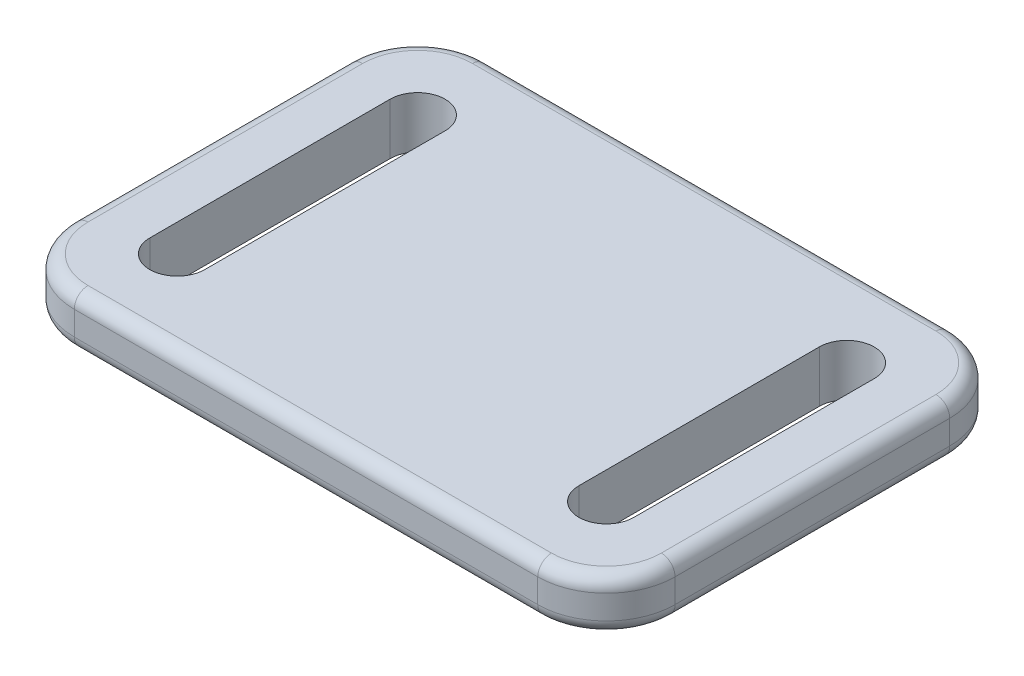
ISO-10303-21;
HEADER;
FILE_DESCRIPTION(('STEP AP214'),'2;1');
FILE_NAME('part.step','',(''),(''),'','','');
FILE_SCHEMA(('AUTOMOTIVE_DESIGN { 1 0 10303 214 1 1 1 1 }'));
ENDSEC;
DATA;
#1=APPLICATION_CONTEXT('core data for automotive mechanical design processes');
#2=APPLICATION_PROTOCOL_DEFINITION('international standard','automotive_design',2000,#1);
#3=PRODUCT_CONTEXT('',#1,'mechanical');
#4=PRODUCT('Part','Part','',(#3));
#5=PRODUCT_RELATED_PRODUCT_CATEGORY('part','',(#4));
#6=PRODUCT_DEFINITION_FORMATION('','',#4);
#7=PRODUCT_DEFINITION_CONTEXT('part definition',#1,'design');
#8=PRODUCT_DEFINITION('design','',#6,#7);
#9=PRODUCT_DEFINITION_SHAPE('','',#8);
#10=(LENGTH_UNIT() NAMED_UNIT(*) SI_UNIT(.MILLI.,.METRE.));
#11=(NAMED_UNIT(*) PLANE_ANGLE_UNIT() SI_UNIT($,.RADIAN.));
#12=(NAMED_UNIT(*) SI_UNIT($,.STERADIAN.) SOLID_ANGLE_UNIT());
#13=UNCERTAINTY_MEASURE_WITH_UNIT(LENGTH_MEASURE(1.E-05),#10,'distance_accuracy_value','');
#14=(GEOMETRIC_REPRESENTATION_CONTEXT(3) GLOBAL_UNCERTAINTY_ASSIGNED_CONTEXT((#13)) GLOBAL_UNIT_ASSIGNED_CONTEXT((#10,
#11,#12)) REPRESENTATION_CONTEXT('',''));
#15=CARTESIAN_POINT('',(0.,0.,0.));
#16=DIRECTION('',(0.,0.,1.));
#17=DIRECTION('',(1.,0.,0.));
#18=AXIS2_PLACEMENT_3D('',#15,#16,#17);
#19=CARTESIAN_POINT('',(0.,3.,0.));
#20=DIRECTION('',(0.,0.,-1.));
#21=DIRECTION('',(-1.,0.,0.));
#22=AXIS2_PLACEMENT_3D('',#19,#20,#21);
#23=PLANE('',#22);
#24=DIRECTION('',(0.,-1.,0.));
#25=VECTOR('',#24,1.);
#26=CARTESIAN_POINT('',(31.,3.,0.));
#27=LINE('',#26,#25);
#28=CARTESIAN_POINT('',(31.,0.8,0.));
#29=VERTEX_POINT('',#28);
#30=CARTESIAN_POINT('',(31.,2.2,0.));
#31=VERTEX_POINT('',#30);
#32=EDGE_CURVE('E294',#29,#31,#27,.F.);
#33=ORIENTED_EDGE('',*,*,#32,.T.);
#34=DIRECTION('',(1.,0.,0.));
#35=VECTOR('',#34,1.);
#36=CARTESIAN_POINT('',(4.,2.2,0.));
#37=LINE('',#36,#35);
#38=CARTESIAN_POINT('',(4.,2.2,0.));
#39=VERTEX_POINT('',#38);
#40=EDGE_CURVE('E330',#31,#39,#37,.F.);
#41=ORIENTED_EDGE('',*,*,#40,.T.);
#42=DIRECTION('',(0.,-1.,0.));
#43=VECTOR('',#42,1.);
#44=CARTESIAN_POINT('',(4.,0.,0.));
#45=LINE('',#44,#43);
#46=CARTESIAN_POINT('',(4.,0.8,0.));
#47=VERTEX_POINT('',#46);
#48=EDGE_CURVE('E297',#39,#47,#45,.T.);
#49=ORIENTED_EDGE('',*,*,#48,.T.);
#50=DIRECTION('',(1.,0.,0.));
#51=VECTOR('',#50,1.);
#52=CARTESIAN_POINT('',(0.,0.8,0.));
#53=LINE('',#52,#51);
#54=EDGE_CURVE('E328',#47,#29,#53,.T.);
#55=ORIENTED_EDGE('',*,*,#54,.T.);
#56=EDGE_LOOP('',(#33,#41,#49,#55));
#57=FACE_BOUND('',#56,.T.);
#58=ADVANCED_FACE('F41',(#57),#23,.F.);
#59=CARTESIAN_POINT('',(35.,3.,0.));
#60=DIRECTION('',(-1.,0.,0.));
#61=DIRECTION('',(0.,0.,1.));
#62=AXIS2_PLACEMENT_3D('',#59,#60,#61);
#63=PLANE('',#62);
#64=DIRECTION('',(0.,-1.,0.));
#65=VECTOR('',#64,1.);
#66=CARTESIAN_POINT('',(35.,3.,-4.));
#67=LINE('',#66,#65);
#68=CARTESIAN_POINT('',(35.,2.2,-4.));
#69=VERTEX_POINT('',#68);
#70=CARTESIAN_POINT('',(35.,0.8,-4.));
#71=VERTEX_POINT('',#70);
#72=EDGE_CURVE('E303',#69,#71,#67,.T.);
#73=ORIENTED_EDGE('',*,*,#72,.T.);
#74=DIRECTION('',(0.,0.,-1.));
#75=VECTOR('',#74,1.);
#76=CARTESIAN_POINT('',(35.,0.8,0.));
#77=LINE('',#76,#75);
#78=CARTESIAN_POINT('',(35.,0.8,-20.));
#79=VERTEX_POINT('',#78);
#80=EDGE_CURVE('E11',#71,#79,#77,.T.);
#81=ORIENTED_EDGE('',*,*,#80,.T.);
#82=DIRECTION('',(0.,-1.,0.));
#83=VECTOR('',#82,1.);
#84=CARTESIAN_POINT('',(35.,3.,-20.));
#85=LINE('',#84,#83);
#86=CARTESIAN_POINT('',(35.,2.2,-20.));
#87=VERTEX_POINT('',#86);
#88=EDGE_CURVE('E300',#79,#87,#85,.F.);
#89=ORIENTED_EDGE('',*,*,#88,.T.);
#90=DIRECTION('',(0.,0.,-1.));
#91=VECTOR('',#90,1.);
#92=CARTESIAN_POINT('',(35.,2.2,-4.));
#93=LINE('',#92,#91);
#94=EDGE_CURVE('E50',#87,#69,#93,.F.);
#95=ORIENTED_EDGE('',*,*,#94,.T.);
#96=EDGE_LOOP('',(#73,#81,#89,#95));
#97=FACE_BOUND('',#96,.T.);
#98=ADVANCED_FACE('F440',(#97),#63,.F.);
#99=CARTESIAN_POINT('',(0.,3.,-24.));
#100=DIRECTION('',(0.,0.,-1.));
#101=DIRECTION('',(-1.,0.,0.));
#102=AXIS2_PLACEMENT_3D('',#99,#100,#101);
#103=PLANE('',#102);
#104=DIRECTION('',(0.,-1.,0.));
#105=VECTOR('',#104,1.);
#106=CARTESIAN_POINT('',(4.,3.,-24.));
#107=LINE('',#106,#105);
#108=CARTESIAN_POINT('',(4.,0.8,-24.));
#109=VERTEX_POINT('',#108);
#110=CARTESIAN_POINT('',(4.,2.2,-24.));
#111=VERTEX_POINT('',#110);
#112=EDGE_CURVE('E291',#109,#111,#107,.F.);
#113=ORIENTED_EDGE('',*,*,#112,.T.);
#114=DIRECTION('',(1.,0.,0.));
#115=VECTOR('',#114,1.);
#116=CARTESIAN_POINT('',(0.,2.2,-24.));
#117=LINE('',#116,#115);
#118=CARTESIAN_POINT('',(31.,2.2,-24.));
#119=VERTEX_POINT('',#118);
#120=EDGE_CURVE('E347',#111,#119,#117,.T.);
#121=ORIENTED_EDGE('',*,*,#120,.T.);
#122=DIRECTION('',(0.,-1.,0.));
#123=VECTOR('',#122,1.);
#124=CARTESIAN_POINT('',(31.,0.,-24.));
#125=LINE('',#124,#123);
#126=CARTESIAN_POINT('',(31.,0.8,-24.));
#127=VERTEX_POINT('',#126);
#128=EDGE_CURVE('E288',#119,#127,#125,.T.);
#129=ORIENTED_EDGE('',*,*,#128,.T.);
#130=DIRECTION('',(1.,0.,0.));
#131=VECTOR('',#130,1.);
#132=CARTESIAN_POINT('',(4.,0.8,-24.));
#133=LINE('',#132,#131);
#134=EDGE_CURVE('E345',#127,#109,#133,.F.);
#135=ORIENTED_EDGE('',*,*,#134,.T.);
#136=EDGE_LOOP('',(#113,#121,#129,#135));
#137=FACE_BOUND('',#136,.T.);
#138=ADVANCED_FACE('F426',(#137),#103,.T.);
#139=CARTESIAN_POINT('',(0.,3.,0.));
#140=DIRECTION('',(-1.,0.,0.));
#141=DIRECTION('',(0.,0.,1.));
#142=AXIS2_PLACEMENT_3D('',#139,#140,#141);
#143=PLANE('',#142);
#144=DIRECTION('',(0.,-1.,0.));
#145=VECTOR('',#144,1.);
#146=CARTESIAN_POINT('',(0.,3.,-4.));
#147=LINE('',#146,#145);
#148=CARTESIAN_POINT('',(0.,0.8,-4.));
#149=VERTEX_POINT('',#148);
#150=CARTESIAN_POINT('',(0.,2.2,-4.));
#151=VERTEX_POINT('',#150);
#152=EDGE_CURVE('E282',#149,#151,#147,.F.);
#153=ORIENTED_EDGE('',*,*,#152,.T.);
#154=DIRECTION('',(0.,0.,-1.));
#155=VECTOR('',#154,1.);
#156=CARTESIAN_POINT('',(0.,2.2,0.));
#157=LINE('',#156,#155);
#158=CARTESIAN_POINT('',(0.,2.2,-20.));
#159=VERTEX_POINT('',#158);
#160=EDGE_CURVE('E339',#151,#159,#157,.T.);
#161=ORIENTED_EDGE('',*,*,#160,.T.);
#162=DIRECTION('',(0.,-1.,0.));
#163=VECTOR('',#162,1.);
#164=CARTESIAN_POINT('',(0.,3.,-20.));
#165=LINE('',#164,#163);
#166=CARTESIAN_POINT('',(0.,0.8,-20.));
#167=VERTEX_POINT('',#166);
#168=EDGE_CURVE('E285',#159,#167,#165,.T.);
#169=ORIENTED_EDGE('',*,*,#168,.T.);
#170=DIRECTION('',(0.,0.,-1.));
#171=VECTOR('',#170,1.);
#172=CARTESIAN_POINT('',(0.,0.8,-4.));
#173=LINE('',#172,#171);
#174=EDGE_CURVE('E337',#167,#149,#173,.F.);
#175=ORIENTED_EDGE('',*,*,#174,.T.);
#176=EDGE_LOOP('',(#153,#161,#169,#175));
#177=FACE_BOUND('',#176,.T.);
#178=ADVANCED_FACE('F478',(#177),#143,.T.);
#179=CARTESIAN_POINT('',(0.,3.,0.));
#180=DIRECTION('',(0.,1.,0.));
#181=DIRECTION('',(0.,0.,1.));
#182=AXIS2_PLACEMENT_3D('',#179,#180,#181);
#183=PLANE('',#182);
#184=DIRECTION('',(1.,0.,0.));
#185=VECTOR('',#184,1.);
#186=CARTESIAN_POINT('',(31.,3.,-0.8));
#187=LINE('',#186,#185);
#188=CARTESIAN_POINT('',(4.,3.,-0.8));
#189=VERTEX_POINT('',#188);
#190=CARTESIAN_POINT('',(31.,3.,-0.8));
#191=VERTEX_POINT('',#190);
#192=EDGE_CURVE('E318',#189,#191,#187,.T.);
#193=ORIENTED_EDGE('',*,*,#192,.T.);
#194=CARTESIAN_POINT('',(31.,3.,-4.));
#195=DIRECTION('',(0.,1.,0.));
#196=DIRECTION('',(0.,0.,1.));
#197=AXIS2_PLACEMENT_3D('',#194,#195,#196);
#198=CIRCLE('',#197,3.2);
#199=CARTESIAN_POINT('',(34.2,3.,-4.));
#200=VERTEX_POINT('',#199);
#201=EDGE_CURVE('E320',#191,#200,#198,.T.);
#202=ORIENTED_EDGE('',*,*,#201,.T.);
#203=DIRECTION('',(0.,0.,-1.));
#204=VECTOR('',#203,1.);
#205=CARTESIAN_POINT('',(34.2,3.,-20.));
#206=LINE('',#205,#204);
#207=CARTESIAN_POINT('',(34.2,3.,-20.));
#208=VERTEX_POINT('',#207);
#209=EDGE_CURVE('E306',#200,#208,#206,.T.);
#210=ORIENTED_EDGE('',*,*,#209,.T.);
#211=CARTESIAN_POINT('',(31.,3.,-20.));
#212=DIRECTION('',(0.,1.,0.));
#213=DIRECTION('',(0.,0.,1.));
#214=AXIS2_PLACEMENT_3D('',#211,#212,#213);
#215=CIRCLE('',#214,3.2);
#216=CARTESIAN_POINT('',(31.,3.,-23.2));
#217=VERTEX_POINT('',#216);
#218=EDGE_CURVE('E308',#208,#217,#215,.T.);
#219=ORIENTED_EDGE('',*,*,#218,.T.);
#220=DIRECTION('',(1.,0.,0.));
#221=VECTOR('',#220,1.);
#222=CARTESIAN_POINT('',(0.,3.,-23.2));
#223=LINE('',#222,#221);
#224=CARTESIAN_POINT('',(4.,3.,-23.2));
#225=VERTEX_POINT('',#224);
#226=EDGE_CURVE('E310',#217,#225,#223,.F.);
#227=ORIENTED_EDGE('',*,*,#226,.T.);
#228=CARTESIAN_POINT('',(4.,3.,-20.));
#229=DIRECTION('',(0.,1.,0.));
#230=DIRECTION('',(0.,0.,1.));
#231=AXIS2_PLACEMENT_3D('',#228,#229,#230);
#232=CIRCLE('',#231,3.2);
#233=CARTESIAN_POINT('',(0.8,3.,-20.));
#234=VERTEX_POINT('',#233);
#235=EDGE_CURVE('E312',#225,#234,#232,.T.);
#236=ORIENTED_EDGE('',*,*,#235,.T.);
#237=DIRECTION('',(0.,0.,-1.));
#238=VECTOR('',#237,1.);
#239=CARTESIAN_POINT('',(0.8,3.,0.));
#240=LINE('',#239,#238);
#241=CARTESIAN_POINT('',(0.8,3.,-4.));
#242=VERTEX_POINT('',#241);
#243=EDGE_CURVE('E314',#234,#242,#240,.F.);
#244=ORIENTED_EDGE('',*,*,#243,.T.);
#245=CARTESIAN_POINT('',(4.,3.,-4.));
#246=DIRECTION('',(0.,1.,0.));
#247=DIRECTION('',(0.,0.,1.));
#248=AXIS2_PLACEMENT_3D('',#245,#246,#247);
#249=CIRCLE('',#248,3.2);
#250=EDGE_CURVE('E316',#242,#189,#249,.T.);
#251=ORIENTED_EDGE('',*,*,#250,.T.);
#252=EDGE_LOOP('',(#193,#202,#210,#219,#227,#236,#244,#251));
#253=FACE_BOUND('',#252,.T.);
#254=CARTESIAN_POINT('',(5.,3.,-19.));
#255=DIRECTION('',(0.,1.,0.));
#256=DIRECTION('',(0.,0.,1.));
#257=AXIS2_PLACEMENT_3D('',#254,#255,#256);
#258=CIRCLE('',#257,1.6);
#259=CARTESIAN_POINT('',(6.6,3.,-19.));
#260=VERTEX_POINT('',#259);
#261=CARTESIAN_POINT('',(3.4,3.,-19.));
#262=VERTEX_POINT('',#261);
#263=EDGE_CURVE('E226',#260,#262,#258,.T.);
#264=ORIENTED_EDGE('',*,*,#263,.F.);
#265=DIRECTION('',(0.,0.,-1.));
#266=VECTOR('',#265,1.);
#267=CARTESIAN_POINT('',(6.6,3.,-19.));
#268=LINE('',#267,#266);
#269=CARTESIAN_POINT('',(6.6,3.,-5.));
#270=VERTEX_POINT('',#269);
#271=EDGE_CURVE('E231',#270,#260,#268,.T.);
#272=ORIENTED_EDGE('',*,*,#271,.F.);
#273=CARTESIAN_POINT('',(5.,3.,-5.));
#274=DIRECTION('',(0.,1.,0.));
#275=DIRECTION('',(0.,0.,1.));
#276=AXIS2_PLACEMENT_3D('',#273,#274,#275);
#277=CIRCLE('',#276,1.6);
#278=CARTESIAN_POINT('',(3.4,3.,-5.));
#279=VERTEX_POINT('',#278);
#280=EDGE_CURVE('E210',#279,#270,#277,.T.);
#281=ORIENTED_EDGE('',*,*,#280,.F.);
#282=DIRECTION('',(0.,0.,1.));
#283=VECTOR('',#282,1.);
#284=CARTESIAN_POINT('',(3.4,3.,-19.));
#285=LINE('',#284,#283);
#286=EDGE_CURVE('E221',#262,#279,#285,.T.);
#287=ORIENTED_EDGE('',*,*,#286,.F.);
#288=EDGE_LOOP('',(#264,#272,#281,#287));
#289=FACE_BOUND('',#288,.T.);
#290=CARTESIAN_POINT('',(30.,3.,-19.));
#291=DIRECTION('',(0.,1.,0.));
#292=DIRECTION('',(0.,0.,-1.));
#293=AXIS2_PLACEMENT_3D('',#290,#291,#292);
#294=CIRCLE('',#293,1.6);
#295=CARTESIAN_POINT('',(31.6,3.,-19.));
#296=VERTEX_POINT('',#295);
#297=CARTESIAN_POINT('',(28.4,3.,-19.));
#298=VERTEX_POINT('',#297);
#299=EDGE_CURVE('E260',#296,#298,#294,.T.);
#300=ORIENTED_EDGE('',*,*,#299,.F.);
#301=DIRECTION('',(0.,0.,-1.));
#302=VECTOR('',#301,1.);
#303=CARTESIAN_POINT('',(31.6,3.,-19.));
#304=LINE('',#303,#302);
#305=CARTESIAN_POINT('',(31.6,3.,-5.));
#306=VERTEX_POINT('',#305);
#307=EDGE_CURVE('E244',#306,#296,#304,.T.);
#308=ORIENTED_EDGE('',*,*,#307,.F.);
#309=CARTESIAN_POINT('',(30.,3.,-5.));
#310=DIRECTION('',(0.,1.,0.));
#311=DIRECTION('',(0.,0.,-1.));
#312=AXIS2_PLACEMENT_3D('',#309,#310,#311);
#313=CIRCLE('',#312,1.6);
#314=CARTESIAN_POINT('',(28.4,3.,-5.));
#315=VERTEX_POINT('',#314);
#316=EDGE_CURVE('E254',#315,#306,#313,.T.);
#317=ORIENTED_EDGE('',*,*,#316,.F.);
#318=DIRECTION('',(0.,0.,1.));
#319=VECTOR('',#318,1.);
#320=CARTESIAN_POINT('',(28.4,3.,-19.));
#321=LINE('',#320,#319);
#322=EDGE_CURVE('E257',#298,#315,#321,.T.);
#323=ORIENTED_EDGE('',*,*,#322,.F.);
#324=EDGE_LOOP('',(#300,#308,#317,#323));
#325=FACE_BOUND('',#324,.T.);
#326=ADVANCED_FACE('F228',(#253,#289,#325),#183,.T.);
#327=CARTESIAN_POINT('',(0.,0.,0.));
#328=DIRECTION('',(0.,1.,0.));
#329=DIRECTION('',(0.,0.,1.));
#330=AXIS2_PLACEMENT_3D('',#327,#328,#329);
#331=PLANE('',#330);
#332=DIRECTION('',(1.,0.,0.));
#333=VECTOR('',#332,1.);
#334=CARTESIAN_POINT('',(0.,0.,-0.8));
#335=LINE('',#334,#333);
#336=CARTESIAN_POINT('',(31.,0.,-0.8));
#337=VERTEX_POINT('',#336);
#338=CARTESIAN_POINT('',(4.,0.,-0.8));
#339=VERTEX_POINT('',#338);
#340=EDGE_CURVE('E353',#337,#339,#335,.F.);
#341=ORIENTED_EDGE('',*,*,#340,.T.);
#342=CARTESIAN_POINT('',(4.,0.,-4.));
#343=DIRECTION('',(0.,1.,0.));
#344=DIRECTION('',(0.,0.,1.));
#345=AXIS2_PLACEMENT_3D('',#342,#343,#344);
#346=CIRCLE('',#345,3.2);
#347=CARTESIAN_POINT('',(0.8,0.,-4.));
#348=VERTEX_POINT('',#347);
#349=EDGE_CURVE('E366',#339,#348,#346,.F.);
#350=ORIENTED_EDGE('',*,*,#349,.T.);
#351=DIRECTION('',(0.,0.,-1.));
#352=VECTOR('',#351,1.);
#353=CARTESIAN_POINT('',(0.8,0.,-20.));
#354=LINE('',#353,#352);
#355=CARTESIAN_POINT('',(0.8,0.,-20.));
#356=VERTEX_POINT('',#355);
#357=EDGE_CURVE('E65',#348,#356,#354,.T.);
#358=ORIENTED_EDGE('',*,*,#357,.T.);
#359=CARTESIAN_POINT('',(4.,0.,-20.));
#360=DIRECTION('',(0.,1.,0.));
#361=DIRECTION('',(0.,0.,1.));
#362=AXIS2_PLACEMENT_3D('',#359,#360,#361);
#363=CIRCLE('',#362,3.2);
#364=CARTESIAN_POINT('',(4.,0.,-23.2));
#365=VERTEX_POINT('',#364);
#366=EDGE_CURVE('E363',#356,#365,#363,.F.);
#367=ORIENTED_EDGE('',*,*,#366,.T.);
#368=DIRECTION('',(1.,0.,0.));
#369=VECTOR('',#368,1.);
#370=CARTESIAN_POINT('',(31.,0.,-23.2));
#371=LINE('',#370,#369);
#372=CARTESIAN_POINT('',(31.,0.,-23.2));
#373=VERTEX_POINT('',#372);
#374=EDGE_CURVE('E361',#365,#373,#371,.T.);
#375=ORIENTED_EDGE('',*,*,#374,.T.);
#376=CARTESIAN_POINT('',(31.,0.,-20.));
#377=DIRECTION('',(0.,1.,0.));
#378=DIRECTION('',(0.,0.,1.));
#379=AXIS2_PLACEMENT_3D('',#376,#377,#378);
#380=CIRCLE('',#379,3.2);
#381=CARTESIAN_POINT('',(34.2,0.,-20.));
#382=VERTEX_POINT('',#381);
#383=EDGE_CURVE('E359',#373,#382,#380,.F.);
#384=ORIENTED_EDGE('',*,*,#383,.T.);
#385=DIRECTION('',(0.,0.,-1.));
#386=VECTOR('',#385,1.);
#387=CARTESIAN_POINT('',(34.2,0.,0.));
#388=LINE('',#387,#386);
#389=CARTESIAN_POINT('',(34.2,0.,-4.));
#390=VERTEX_POINT('',#389);
#391=EDGE_CURVE('E357',#382,#390,#388,.F.);
#392=ORIENTED_EDGE('',*,*,#391,.T.);
#393=CARTESIAN_POINT('',(31.,0.,-4.));
#394=DIRECTION('',(0.,1.,0.));
#395=DIRECTION('',(0.,0.,1.));
#396=AXIS2_PLACEMENT_3D('',#393,#394,#395);
#397=CIRCLE('',#396,3.2);
#398=EDGE_CURVE('E355',#390,#337,#397,.F.);
#399=ORIENTED_EDGE('',*,*,#398,.T.);
#400=EDGE_LOOP('',(#341,#350,#358,#367,#375,#384,#392,#399));
#401=FACE_BOUND('',#400,.T.);
#402=DIRECTION('',(0.,0.,-1.));
#403=VECTOR('',#402,1.);
#404=CARTESIAN_POINT('',(6.6,0.,0.));
#405=LINE('',#404,#403);
#406=CARTESIAN_POINT('',(6.6,0.,-5.));
#407=VERTEX_POINT('',#406);
#408=CARTESIAN_POINT('',(6.6,0.,-19.));
#409=VERTEX_POINT('',#408);
#410=EDGE_CURVE('E276',#407,#409,#405,.T.);
#411=ORIENTED_EDGE('',*,*,#410,.T.);
#412=CARTESIAN_POINT('',(5.,0.,-19.));
#413=DIRECTION('',(0.,1.,0.));
#414=DIRECTION('',(0.,0.,1.));
#415=AXIS2_PLACEMENT_3D('',#412,#413,#414);
#416=CIRCLE('',#415,1.6);
#417=CARTESIAN_POINT('',(3.4,0.,-19.));
#418=VERTEX_POINT('',#417);
#419=EDGE_CURVE('E279',#409,#418,#416,.T.);
#420=ORIENTED_EDGE('',*,*,#419,.T.);
#421=DIRECTION('',(0.,0.,1.));
#422=VECTOR('',#421,1.);
#423=CARTESIAN_POINT('',(3.4,0.,0.));
#424=LINE('',#423,#422);
#425=CARTESIAN_POINT('',(3.4,0.,-5.));
#426=VERTEX_POINT('',#425);
#427=EDGE_CURVE('E273',#418,#426,#424,.T.);
#428=ORIENTED_EDGE('',*,*,#427,.T.);
#429=CARTESIAN_POINT('',(5.,0.,-5.));
#430=DIRECTION('',(0.,1.,0.));
#431=DIRECTION('',(0.,0.,1.));
#432=AXIS2_PLACEMENT_3D('',#429,#430,#431);
#433=CIRCLE('',#432,1.6);
#434=EDGE_CURVE('E213',#426,#407,#433,.T.);
#435=ORIENTED_EDGE('',*,*,#434,.T.);
#436=EDGE_LOOP('',(#411,#420,#428,#435));
#437=FACE_BOUND('',#436,.T.);
#438=DIRECTION('',(0.,0.,-1.));
#439=VECTOR('',#438,1.);
#440=CARTESIAN_POINT('',(31.6,0.,0.));
#441=LINE('',#440,#439);
#442=CARTESIAN_POINT('',(31.6,0.,-5.));
#443=VERTEX_POINT('',#442);
#444=CARTESIAN_POINT('',(31.6,0.,-19.));
#445=VERTEX_POINT('',#444);
#446=EDGE_CURVE('E267',#443,#445,#441,.T.);
#447=ORIENTED_EDGE('',*,*,#446,.T.);
#448=CARTESIAN_POINT('',(30.,0.,-19.));
#449=DIRECTION('',(0.,1.,0.));
#450=DIRECTION('',(0.,0.,1.));
#451=AXIS2_PLACEMENT_3D('',#448,#449,#450);
#452=CIRCLE('',#451,1.6);
#453=CARTESIAN_POINT('',(28.4,0.,-19.));
#454=VERTEX_POINT('',#453);
#455=EDGE_CURVE('E270',#445,#454,#452,.T.);
#456=ORIENTED_EDGE('',*,*,#455,.T.);
#457=DIRECTION('',(0.,0.,1.));
#458=VECTOR('',#457,1.);
#459=CARTESIAN_POINT('',(28.4,0.,0.));
#460=LINE('',#459,#458);
#461=CARTESIAN_POINT('',(28.4,0.,-5.));
#462=VERTEX_POINT('',#461);
#463=EDGE_CURVE('E238',#454,#462,#460,.T.);
#464=ORIENTED_EDGE('',*,*,#463,.T.);
#465=CARTESIAN_POINT('',(30.,0.,-5.));
#466=DIRECTION('',(0.,1.,0.));
#467=DIRECTION('',(0.,0.,1.));
#468=AXIS2_PLACEMENT_3D('',#465,#466,#467);
#469=CIRCLE('',#468,1.6);
#470=EDGE_CURVE('E264',#462,#443,#469,.T.);
#471=ORIENTED_EDGE('',*,*,#470,.T.);
#472=EDGE_LOOP('',(#447,#456,#464,#471));
#473=FACE_BOUND('',#472,.T.);
#474=ADVANCED_FACE('F723',(#401,#437,#473),#331,.F.);
#475=CARTESIAN_POINT('',(30.,-4.,-19.));
#476=DIRECTION('',(0.,1.,0.));
#477=DIRECTION('',(0.,0.,1.));
#478=AXIS2_PLACEMENT_3D('',#475,#476,#477);
#479=CYLINDRICAL_SURFACE('',#478,1.6);
#480=DIRECTION('',(0.,1.,0.));
#481=VECTOR('',#480,1.);
#482=CARTESIAN_POINT('',(31.6,-4.,-19.));
#483=LINE('',#482,#481);
#484=EDGE_CURVE('E249',#445,#296,#483,.T.);
#485=ORIENTED_EDGE('',*,*,#484,.T.);
#486=ORIENTED_EDGE('',*,*,#299,.T.);
#487=DIRECTION('',(0.,1.,0.));
#488=VECTOR('',#487,1.);
#489=CARTESIAN_POINT('',(28.4,-4.,-19.));
#490=LINE('',#489,#488);
#491=EDGE_CURVE('E241',#454,#298,#490,.T.);
#492=ORIENTED_EDGE('',*,*,#491,.F.);
#493=ORIENTED_EDGE('',*,*,#455,.F.);
#494=EDGE_LOOP('',(#485,#486,#492,#493));
#495=FACE_BOUND('',#494,.T.);
#496=ADVANCED_FACE('F714',(#495),#479,.F.);
#497=CARTESIAN_POINT('',(31.6,-4.,-19.));
#498=DIRECTION('',(1.,0.,0.));
#499=DIRECTION('',(0.,0.,-1.));
#500=AXIS2_PLACEMENT_3D('',#497,#498,#499);
#501=PLANE('',#500);
#502=DIRECTION('',(0.,1.,0.));
#503=VECTOR('',#502,1.);
#504=CARTESIAN_POINT('',(31.6,-4.,-5.));
#505=LINE('',#504,#503);
#506=EDGE_CURVE('E247',#443,#306,#505,.T.);
#507=ORIENTED_EDGE('',*,*,#506,.T.);
#508=ORIENTED_EDGE('',*,*,#307,.T.);
#509=ORIENTED_EDGE('',*,*,#484,.F.);
#510=ORIENTED_EDGE('',*,*,#446,.F.);
#511=EDGE_LOOP('',(#507,#508,#509,#510));
#512=FACE_BOUND('',#511,.T.);
#513=ADVANCED_FACE('F705',(#512),#501,.F.);
#514=CARTESIAN_POINT('',(30.,-4.,-5.));
#515=DIRECTION('',(0.,1.,0.));
#516=DIRECTION('',(0.,0.,1.));
#517=AXIS2_PLACEMENT_3D('',#514,#515,#516);
#518=CYLINDRICAL_SURFACE('',#517,1.6);
#519=DIRECTION('',(0.,1.,0.));
#520=VECTOR('',#519,1.);
#521=CARTESIAN_POINT('',(28.4,-4.,-5.));
#522=LINE('',#521,#520);
#523=EDGE_CURVE('E245',#462,#315,#522,.T.);
#524=ORIENTED_EDGE('',*,*,#523,.T.);
#525=ORIENTED_EDGE('',*,*,#316,.T.);
#526=ORIENTED_EDGE('',*,*,#506,.F.);
#527=ORIENTED_EDGE('',*,*,#470,.F.);
#528=EDGE_LOOP('',(#524,#525,#526,#527));
#529=FACE_BOUND('',#528,.T.);
#530=ADVANCED_FACE('F696',(#529),#518,.F.);
#531=CARTESIAN_POINT('',(28.4,-4.,-19.));
#532=DIRECTION('',(-1.,0.,0.));
#533=DIRECTION('',(0.,0.,1.));
#534=AXIS2_PLACEMENT_3D('',#531,#532,#533);
#535=PLANE('',#534);
#536=ORIENTED_EDGE('',*,*,#491,.T.);
#537=ORIENTED_EDGE('',*,*,#322,.T.);
#538=ORIENTED_EDGE('',*,*,#523,.F.);
#539=ORIENTED_EDGE('',*,*,#463,.F.);
#540=EDGE_LOOP('',(#536,#537,#538,#539));
#541=FACE_BOUND('',#540,.T.);
#542=ADVANCED_FACE('F687',(#541),#535,.F.);
#543=CARTESIAN_POINT('',(5.,-4.,-19.));
#544=DIRECTION('',(0.,1.,0.));
#545=DIRECTION('',(0.,0.,1.));
#546=AXIS2_PLACEMENT_3D('',#543,#544,#545);
#547=CYLINDRICAL_SURFACE('',#546,1.6);
#548=DIRECTION('',(0.,1.,0.));
#549=VECTOR('',#548,1.);
#550=CARTESIAN_POINT('',(6.6,-4.,-19.));
#551=LINE('',#550,#549);
#552=EDGE_CURVE('E236',#409,#260,#551,.T.);
#553=ORIENTED_EDGE('',*,*,#552,.T.);
#554=ORIENTED_EDGE('',*,*,#263,.T.);
#555=DIRECTION('',(0.,1.,0.));
#556=VECTOR('',#555,1.);
#557=CARTESIAN_POINT('',(3.4,-4.,-19.));
#558=LINE('',#557,#556);
#559=EDGE_CURVE('E217',#418,#262,#558,.T.);
#560=ORIENTED_EDGE('',*,*,#559,.F.);
#561=ORIENTED_EDGE('',*,*,#419,.F.);
#562=EDGE_LOOP('',(#553,#554,#560,#561));
#563=FACE_BOUND('',#562,.T.);
#564=ADVANCED_FACE('F678',(#563),#547,.F.);
#565=CARTESIAN_POINT('',(6.6,-4.,-19.));
#566=DIRECTION('',(1.,0.,0.));
#567=DIRECTION('',(0.,0.,-1.));
#568=AXIS2_PLACEMENT_3D('',#565,#566,#567);
#569=PLANE('',#568);
#570=DIRECTION('',(0.,1.,0.));
#571=VECTOR('',#570,1.);
#572=CARTESIAN_POINT('',(6.6,-4.,-5.));
#573=LINE('',#572,#571);
#574=EDGE_CURVE('E216',#407,#270,#573,.T.);
#575=ORIENTED_EDGE('',*,*,#574,.T.);
#576=ORIENTED_EDGE('',*,*,#271,.T.);
#577=ORIENTED_EDGE('',*,*,#552,.F.);
#578=ORIENTED_EDGE('',*,*,#410,.F.);
#579=EDGE_LOOP('',(#575,#576,#577,#578));
#580=FACE_BOUND('',#579,.T.);
#581=ADVANCED_FACE('F670',(#580),#569,.F.);
#582=CARTESIAN_POINT('',(5.,-4.,-5.));
#583=DIRECTION('',(0.,1.,0.));
#584=DIRECTION('',(0.,0.,1.));
#585=AXIS2_PLACEMENT_3D('',#582,#583,#584);
#586=CYLINDRICAL_SURFACE('',#585,1.6);
#587=DIRECTION('',(0.,1.,0.));
#588=VECTOR('',#587,1.);
#589=CARTESIAN_POINT('',(3.4,-4.,-5.));
#590=LINE('',#589,#588);
#591=EDGE_CURVE('E205',#426,#279,#590,.T.);
#592=ORIENTED_EDGE('',*,*,#591,.T.);
#593=ORIENTED_EDGE('',*,*,#280,.T.);
#594=ORIENTED_EDGE('',*,*,#574,.F.);
#595=ORIENTED_EDGE('',*,*,#434,.F.);
#596=EDGE_LOOP('',(#592,#593,#594,#595));
#597=FACE_BOUND('',#596,.T.);
#598=ADVANCED_FACE('F207',(#597),#586,.F.);
#599=CARTESIAN_POINT('',(3.4,-4.,-19.));
#600=DIRECTION('',(-1.,0.,0.));
#601=DIRECTION('',(0.,0.,1.));
#602=AXIS2_PLACEMENT_3D('',#599,#600,#601);
#603=PLANE('',#602);
#604=ORIENTED_EDGE('',*,*,#559,.T.);
#605=ORIENTED_EDGE('',*,*,#286,.T.);
#606=ORIENTED_EDGE('',*,*,#591,.F.);
#607=ORIENTED_EDGE('',*,*,#427,.F.);
#608=EDGE_LOOP('',(#604,#605,#606,#607));
#609=FACE_BOUND('',#608,.T.);
#610=ADVANCED_FACE('F222',(#609),#603,.F.);
#611=CARTESIAN_POINT('',(4.,3.,-20.));
#612=DIRECTION('',(0.,-1.,0.));
#613=DIRECTION('',(0.,0.,-1.));
#614=AXIS2_PLACEMENT_3D('',#611,#612,#613);
#615=CYLINDRICAL_SURFACE('',#614,4.);
#616=ORIENTED_EDGE('',*,*,#168,.F.);
#617=CARTESIAN_POINT('',(4.,2.2,-20.));
#618=DIRECTION('',(0.,1.,0.));
#619=DIRECTION('',(0.,0.,1.));
#620=AXIS2_PLACEMENT_3D('',#617,#618,#619);
#621=CIRCLE('',#620,4.);
#622=EDGE_CURVE('E343',#159,#111,#621,.F.);
#623=ORIENTED_EDGE('',*,*,#622,.T.);
#624=ORIENTED_EDGE('',*,*,#112,.F.);
#625=CARTESIAN_POINT('',(4.,0.8,-20.));
#626=DIRECTION('',(0.,1.,0.));
#627=DIRECTION('',(0.,0.,1.));
#628=AXIS2_PLACEMENT_3D('',#625,#626,#627);
#629=CIRCLE('',#628,4.);
#630=EDGE_CURVE('E341',#109,#167,#629,.T.);
#631=ORIENTED_EDGE('',*,*,#630,.T.);
#632=EDGE_LOOP('',(#616,#623,#624,#631));
#633=FACE_BOUND('',#632,.T.);
#634=ADVANCED_FACE('F482',(#633),#615,.T.);
#635=CARTESIAN_POINT('',(4.,3.,-4.));
#636=DIRECTION('',(0.,1.,0.));
#637=DIRECTION('',(0.,0.,1.));
#638=AXIS2_PLACEMENT_3D('',#635,#636,#637);
#639=CYLINDRICAL_SURFACE('',#638,4.);
#640=ORIENTED_EDGE('',*,*,#48,.F.);
#641=CARTESIAN_POINT('',(4.,2.2,-4.));
#642=DIRECTION('',(0.,1.,0.));
#643=DIRECTION('',(0.,0.,1.));
#644=AXIS2_PLACEMENT_3D('',#641,#642,#643);
#645=CIRCLE('',#644,4.);
#646=EDGE_CURVE('E335',#39,#151,#645,.F.);
#647=ORIENTED_EDGE('',*,*,#646,.T.);
#648=ORIENTED_EDGE('',*,*,#152,.F.);
#649=CARTESIAN_POINT('',(4.,0.8,-4.));
#650=DIRECTION('',(0.,1.,0.));
#651=DIRECTION('',(0.,0.,1.));
#652=AXIS2_PLACEMENT_3D('',#649,#650,#651);
#653=CIRCLE('',#652,4.);
#654=EDGE_CURVE('E332',#149,#47,#653,.T.);
#655=ORIENTED_EDGE('',*,*,#654,.T.);
#656=EDGE_LOOP('',(#640,#647,#648,#655));
#657=FACE_BOUND('',#656,.T.);
#658=ADVANCED_FACE('F466',(#657),#639,.T.);
#659=CARTESIAN_POINT('',(31.,3.,-4.));
#660=DIRECTION('',(0.,-1.,0.));
#661=DIRECTION('',(0.,0.,-1.));
#662=AXIS2_PLACEMENT_3D('',#659,#660,#661);
#663=CYLINDRICAL_SURFACE('',#662,4.);
#664=ORIENTED_EDGE('',*,*,#72,.F.);
#665=CARTESIAN_POINT('',(31.,2.2,-4.));
#666=DIRECTION('',(0.,1.,0.));
#667=DIRECTION('',(0.,0.,1.));
#668=AXIS2_PLACEMENT_3D('',#665,#666,#667);
#669=CIRCLE('',#668,4.);
#670=EDGE_CURVE('E325',#69,#31,#669,.F.);
#671=ORIENTED_EDGE('',*,*,#670,.T.);
#672=ORIENTED_EDGE('',*,*,#32,.F.);
#673=CARTESIAN_POINT('',(31.,0.8,-4.));
#674=DIRECTION('',(0.,1.,0.));
#675=DIRECTION('',(0.,0.,1.));
#676=AXIS2_PLACEMENT_3D('',#673,#674,#675);
#677=CIRCLE('',#676,4.);
#678=EDGE_CURVE('E323',#29,#71,#677,.T.);
#679=ORIENTED_EDGE('',*,*,#678,.T.);
#680=EDGE_LOOP('',(#664,#671,#672,#679));
#681=FACE_BOUND('',#680,.T.);
#682=ADVANCED_FACE('F444',(#681),#663,.T.);
#683=CARTESIAN_POINT('',(31.,3.,-20.));
#684=DIRECTION('',(0.,1.,0.));
#685=DIRECTION('',(0.,0.,1.));
#686=AXIS2_PLACEMENT_3D('',#683,#684,#685);
#687=CYLINDRICAL_SURFACE('',#686,4.);
#688=ORIENTED_EDGE('',*,*,#128,.F.);
#689=CARTESIAN_POINT('',(31.,2.2,-20.));
#690=DIRECTION('',(0.,1.,0.));
#691=DIRECTION('',(0.,0.,1.));
#692=AXIS2_PLACEMENT_3D('',#689,#690,#691);
#693=CIRCLE('',#692,4.);
#694=EDGE_CURVE('E351',#119,#87,#693,.F.);
#695=ORIENTED_EDGE('',*,*,#694,.T.);
#696=ORIENTED_EDGE('',*,*,#88,.F.);
#697=CARTESIAN_POINT('',(31.,0.8,-20.));
#698=DIRECTION('',(0.,1.,0.));
#699=DIRECTION('',(0.,0.,1.));
#700=AXIS2_PLACEMENT_3D('',#697,#698,#699);
#701=CIRCLE('',#700,4.);
#702=EDGE_CURVE('E349',#79,#127,#701,.T.);
#703=ORIENTED_EDGE('',*,*,#702,.T.);
#704=EDGE_LOOP('',(#688,#695,#696,#703));
#705=FACE_BOUND('',#704,.T.);
#706=ADVANCED_FACE('F423',(#705),#687,.T.);
#707=CARTESIAN_POINT('',(4.,2.2,-20.));
#708=DIRECTION('',(0.,1.,0.));
#709=DIRECTION('',(0.,0.,1.));
#710=AXIS2_PLACEMENT_3D('',#707,#708,#709);
#711=TOROIDAL_SURFACE('',#710,3.2,0.8);
#712=CARTESIAN_POINT('',(4.,2.2,-23.2));
#713=DIRECTION('',(1.,0.,0.));
#714=DIRECTION('',(0.,0.,-1.));
#715=AXIS2_PLACEMENT_3D('',#712,#713,#714);
#716=CIRCLE('',#715,0.8);
#717=EDGE_CURVE('E385',#111,#225,#716,.T.);
#718=ORIENTED_EDGE('',*,*,#717,.F.);
#719=ORIENTED_EDGE('',*,*,#622,.F.);
#720=CARTESIAN_POINT('',(0.8,2.2,-20.));
#721=DIRECTION('',(0.,0.,1.));
#722=DIRECTION('',(1.,0.,0.));
#723=AXIS2_PLACEMENT_3D('',#720,#721,#722);
#724=CIRCLE('',#723,0.8);
#725=EDGE_CURVE('E251',#234,#159,#724,.T.);
#726=ORIENTED_EDGE('',*,*,#725,.F.);
#727=ORIENTED_EDGE('',*,*,#235,.F.);
#728=EDGE_LOOP('',(#718,#719,#726,#727));
#729=FACE_BOUND('',#728,.T.);
#730=ADVANCED_FACE('F485',(#729),#711,.T.);
#731=CARTESIAN_POINT('',(0.8,2.2,0.));
#732=DIRECTION('',(0.,0.,-1.));
#733=DIRECTION('',(-1.,0.,0.));
#734=AXIS2_PLACEMENT_3D('',#731,#732,#733);
#735=CYLINDRICAL_SURFACE('',#734,0.8);
#736=ORIENTED_EDGE('',*,*,#725,.T.);
#737=ORIENTED_EDGE('',*,*,#160,.F.);
#738=CARTESIAN_POINT('',(0.8,2.2,-4.));
#739=DIRECTION('',(0.,0.,1.));
#740=DIRECTION('',(1.,0.,0.));
#741=AXIS2_PLACEMENT_3D('',#738,#739,#740);
#742=CIRCLE('',#741,0.8);
#743=EDGE_CURVE('E382',#242,#151,#742,.T.);
#744=ORIENTED_EDGE('',*,*,#743,.F.);
#745=ORIENTED_EDGE('',*,*,#243,.F.);
#746=EDGE_LOOP('',(#736,#737,#744,#745));
#747=FACE_BOUND('',#746,.T.);
#748=ADVANCED_FACE('F474',(#747),#735,.T.);
#749=CARTESIAN_POINT('',(0.,2.2,-23.2));
#750=DIRECTION('',(1.,0.,0.));
#751=DIRECTION('',(0.,0.,-1.));
#752=AXIS2_PLACEMENT_3D('',#749,#750,#751);
#753=CYLINDRICAL_SURFACE('',#752,0.8);
#754=ORIENTED_EDGE('',*,*,#717,.T.);
#755=ORIENTED_EDGE('',*,*,#226,.F.);
#756=CARTESIAN_POINT('',(31.,2.2,-23.2));
#757=DIRECTION('',(1.,0.,0.));
#758=DIRECTION('',(0.,0.,-1.));
#759=AXIS2_PLACEMENT_3D('',#756,#757,#758);
#760=CIRCLE('',#759,0.8);
#761=EDGE_CURVE('E379',#119,#217,#760,.T.);
#762=ORIENTED_EDGE('',*,*,#761,.F.);
#763=ORIENTED_EDGE('',*,*,#120,.F.);
#764=EDGE_LOOP('',(#754,#755,#762,#763));
#765=FACE_BOUND('',#764,.T.);
#766=ADVANCED_FACE('F431',(#765),#753,.T.);
#767=CARTESIAN_POINT('',(4.,2.2,-4.));
#768=DIRECTION('',(0.,1.,0.));
#769=DIRECTION('',(0.,0.,1.));
#770=AXIS2_PLACEMENT_3D('',#767,#768,#769);
#771=TOROIDAL_SURFACE('',#770,3.2,0.8);
#772=ORIENTED_EDGE('',*,*,#743,.T.);
#773=ORIENTED_EDGE('',*,*,#646,.F.);
#774=CARTESIAN_POINT('',(4.,2.2,-0.8));
#775=DIRECTION('',(1.,0.,0.));
#776=DIRECTION('',(0.,0.,-1.));
#777=AXIS2_PLACEMENT_3D('',#774,#775,#776);
#778=CIRCLE('',#777,0.8);
#779=EDGE_CURVE('E376',#189,#39,#778,.T.);
#780=ORIENTED_EDGE('',*,*,#779,.F.);
#781=ORIENTED_EDGE('',*,*,#250,.F.);
#782=EDGE_LOOP('',(#772,#773,#780,#781));
#783=FACE_BOUND('',#782,.T.);
#784=ADVANCED_FACE('F469',(#783),#771,.T.);
#785=CARTESIAN_POINT('',(31.,2.2,-20.));
#786=DIRECTION('',(0.,1.,0.));
#787=DIRECTION('',(0.,0.,1.));
#788=AXIS2_PLACEMENT_3D('',#785,#786,#787);
#789=TOROIDAL_SURFACE('',#788,3.2,0.8);
#790=ORIENTED_EDGE('',*,*,#761,.T.);
#791=ORIENTED_EDGE('',*,*,#218,.F.);
#792=CARTESIAN_POINT('',(34.2,2.2,-20.));
#793=DIRECTION('',(0.,0.,1.));
#794=DIRECTION('',(1.,0.,0.));
#795=AXIS2_PLACEMENT_3D('',#792,#793,#794);
#796=CIRCLE('',#795,0.8);
#797=EDGE_CURVE('E373',#87,#208,#796,.T.);
#798=ORIENTED_EDGE('',*,*,#797,.F.);
#799=ORIENTED_EDGE('',*,*,#694,.F.);
#800=EDGE_LOOP('',(#790,#791,#798,#799));
#801=FACE_BOUND('',#800,.T.);
#802=ADVANCED_FACE('F437',(#801),#789,.T.);
#803=CARTESIAN_POINT('',(0.,2.2,-0.8));
#804=DIRECTION('',(-1.,0.,0.));
#805=DIRECTION('',(0.,0.,1.));
#806=AXIS2_PLACEMENT_3D('',#803,#804,#805);
#807=CYLINDRICAL_SURFACE('',#806,0.8);
#808=ORIENTED_EDGE('',*,*,#779,.T.);
#809=ORIENTED_EDGE('',*,*,#40,.F.);
#810=CARTESIAN_POINT('',(31.,2.2,-0.8));
#811=DIRECTION('',(1.,0.,0.));
#812=DIRECTION('',(0.,0.,-1.));
#813=AXIS2_PLACEMENT_3D('',#810,#811,#812);
#814=CIRCLE('',#813,0.8);
#815=EDGE_CURVE('E371',#191,#31,#814,.T.);
#816=ORIENTED_EDGE('',*,*,#815,.F.);
#817=ORIENTED_EDGE('',*,*,#192,.F.);
#818=EDGE_LOOP('',(#808,#809,#816,#817));
#819=FACE_BOUND('',#818,.T.);
#820=ADVANCED_FACE('F461',(#819),#807,.T.);
#821=CARTESIAN_POINT('',(34.2,2.2,0.));
#822=DIRECTION('',(0.,0.,1.));
#823=DIRECTION('',(1.,0.,0.));
#824=AXIS2_PLACEMENT_3D('',#821,#822,#823);
#825=CYLINDRICAL_SURFACE('',#824,0.8);
#826=ORIENTED_EDGE('',*,*,#797,.T.);
#827=ORIENTED_EDGE('',*,*,#209,.F.);
#828=CARTESIAN_POINT('',(34.2,2.2,-4.));
#829=DIRECTION('',(0.,0.,1.));
#830=DIRECTION('',(1.,0.,0.));
#831=AXIS2_PLACEMENT_3D('',#828,#829,#830);
#832=CIRCLE('',#831,0.8);
#833=EDGE_CURVE('E369',#69,#200,#832,.T.);
#834=ORIENTED_EDGE('',*,*,#833,.F.);
#835=ORIENTED_EDGE('',*,*,#94,.F.);
#836=EDGE_LOOP('',(#826,#827,#834,#835));
#837=FACE_BOUND('',#836,.T.);
#838=ADVANCED_FACE('F455',(#837),#825,.T.);
#839=CARTESIAN_POINT('',(31.,2.2,-4.));
#840=DIRECTION('',(0.,1.,0.));
#841=DIRECTION('',(0.,0.,1.));
#842=AXIS2_PLACEMENT_3D('',#839,#840,#841);
#843=TOROIDAL_SURFACE('',#842,3.2,0.8);
#844=ORIENTED_EDGE('',*,*,#815,.T.);
#845=ORIENTED_EDGE('',*,*,#670,.F.);
#846=ORIENTED_EDGE('',*,*,#833,.T.);
#847=ORIENTED_EDGE('',*,*,#201,.F.);
#848=EDGE_LOOP('',(#844,#845,#846,#847));
#849=FACE_BOUND('',#848,.T.);
#850=ADVANCED_FACE('F449',(#849),#843,.T.);
#851=CARTESIAN_POINT('',(31.,0.8,-20.));
#852=DIRECTION('',(0.,1.,0.));
#853=DIRECTION('',(0.,0.,1.));
#854=AXIS2_PLACEMENT_3D('',#851,#852,#853);
#855=TOROIDAL_SURFACE('',#854,3.2,0.8);
#856=CARTESIAN_POINT('',(31.,0.8,-23.2));
#857=DIRECTION('',(-1.,0.,0.));
#858=DIRECTION('',(0.,0.,1.));
#859=AXIS2_PLACEMENT_3D('',#856,#857,#858);
#860=CIRCLE('',#859,0.8);
#861=EDGE_CURVE('E404',#127,#373,#860,.T.);
#862=ORIENTED_EDGE('',*,*,#861,.F.);
#863=ORIENTED_EDGE('',*,*,#702,.F.);
#864=CARTESIAN_POINT('',(34.2,0.8,-20.));
#865=DIRECTION('',(0.,0.,1.));
#866=DIRECTION('',(1.,0.,0.));
#867=AXIS2_PLACEMENT_3D('',#864,#865,#866);
#868=CIRCLE('',#867,0.8);
#869=EDGE_CURVE('E45',#382,#79,#868,.T.);
#870=ORIENTED_EDGE('',*,*,#869,.F.);
#871=ORIENTED_EDGE('',*,*,#383,.F.);
#872=EDGE_LOOP('',(#862,#863,#870,#871));
#873=FACE_BOUND('',#872,.T.);
#874=ADVANCED_FACE('F43',(#873),#855,.T.);
#875=CARTESIAN_POINT('',(34.2,0.8,0.));
#876=DIRECTION('',(0.,0.,-1.));
#877=DIRECTION('',(-1.,0.,0.));
#878=AXIS2_PLACEMENT_3D('',#875,#876,#877);
#879=CYLINDRICAL_SURFACE('',#878,0.8);
#880=ORIENTED_EDGE('',*,*,#869,.T.);
#881=ORIENTED_EDGE('',*,*,#80,.F.);
#882=CARTESIAN_POINT('',(34.2,0.8,-4.));
#883=DIRECTION('',(0.,0.,1.));
#884=DIRECTION('',(1.,0.,0.));
#885=AXIS2_PLACEMENT_3D('',#882,#883,#884);
#886=CIRCLE('',#885,0.8);
#887=EDGE_CURVE('E402',#390,#71,#886,.T.);
#888=ORIENTED_EDGE('',*,*,#887,.F.);
#889=ORIENTED_EDGE('',*,*,#391,.F.);
#890=EDGE_LOOP('',(#880,#881,#888,#889));
#891=FACE_BOUND('',#890,.T.);
#892=ADVANCED_FACE('F415',(#891),#879,.T.);
#893=CARTESIAN_POINT('',(0.,0.8,-23.2));
#894=DIRECTION('',(-1.,0.,0.));
#895=DIRECTION('',(0.,0.,1.));
#896=AXIS2_PLACEMENT_3D('',#893,#894,#895);
#897=CYLINDRICAL_SURFACE('',#896,0.8);
#898=ORIENTED_EDGE('',*,*,#861,.T.);
#899=ORIENTED_EDGE('',*,*,#374,.F.);
#900=CARTESIAN_POINT('',(4.,0.8,-23.2));
#901=DIRECTION('',(-1.,0.,0.));
#902=DIRECTION('',(0.,0.,1.));
#903=AXIS2_PLACEMENT_3D('',#900,#901,#902);
#904=CIRCLE('',#903,0.8);
#905=EDGE_CURVE('E399',#109,#365,#904,.T.);
#906=ORIENTED_EDGE('',*,*,#905,.F.);
#907=ORIENTED_EDGE('',*,*,#134,.F.);
#908=EDGE_LOOP('',(#898,#899,#906,#907));
#909=FACE_BOUND('',#908,.T.);
#910=ADVANCED_FACE('F564',(#909),#897,.T.);
#911=CARTESIAN_POINT('',(31.,0.8,-4.));
#912=DIRECTION('',(0.,1.,0.));
#913=DIRECTION('',(0.,0.,1.));
#914=AXIS2_PLACEMENT_3D('',#911,#912,#913);
#915=TOROIDAL_SURFACE('',#914,3.2,0.8);
#916=ORIENTED_EDGE('',*,*,#887,.T.);
#917=ORIENTED_EDGE('',*,*,#678,.F.);
#918=CARTESIAN_POINT('',(31.,0.8,-0.8));
#919=DIRECTION('',(-1.,0.,0.));
#920=DIRECTION('',(0.,0.,1.));
#921=AXIS2_PLACEMENT_3D('',#918,#919,#920);
#922=CIRCLE('',#921,0.8);
#923=EDGE_CURVE('E396',#337,#29,#922,.T.);
#924=ORIENTED_EDGE('',*,*,#923,.F.);
#925=ORIENTED_EDGE('',*,*,#398,.F.);
#926=EDGE_LOOP('',(#916,#917,#924,#925));
#927=FACE_BOUND('',#926,.T.);
#928=ADVANCED_FACE('F571',(#927),#915,.T.);
#929=CARTESIAN_POINT('',(4.,0.8,-20.));
#930=DIRECTION('',(0.,1.,0.));
#931=DIRECTION('',(0.,0.,1.));
#932=AXIS2_PLACEMENT_3D('',#929,#930,#931);
#933=TOROIDAL_SURFACE('',#932,3.2,0.8);
#934=ORIENTED_EDGE('',*,*,#905,.T.);
#935=ORIENTED_EDGE('',*,*,#366,.F.);
#936=CARTESIAN_POINT('',(0.8,0.8,-20.));
#937=DIRECTION('',(0.,0.,1.));
#938=DIRECTION('',(1.,0.,0.));
#939=AXIS2_PLACEMENT_3D('',#936,#937,#938);
#940=CIRCLE('',#939,0.8);
#941=EDGE_CURVE('E393',#167,#356,#940,.T.);
#942=ORIENTED_EDGE('',*,*,#941,.F.);
#943=ORIENTED_EDGE('',*,*,#630,.F.);
#944=EDGE_LOOP('',(#934,#935,#942,#943));
#945=FACE_BOUND('',#944,.T.);
#946=ADVANCED_FACE('F579',(#945),#933,.T.);
#947=CARTESIAN_POINT('',(0.,0.8,-0.8));
#948=DIRECTION('',(1.,0.,0.));
#949=DIRECTION('',(0.,0.,-1.));
#950=AXIS2_PLACEMENT_3D('',#947,#948,#949);
#951=CYLINDRICAL_SURFACE('',#950,0.8);
#952=ORIENTED_EDGE('',*,*,#923,.T.);
#953=ORIENTED_EDGE('',*,*,#54,.F.);
#954=CARTESIAN_POINT('',(4.,0.8,-0.8));
#955=DIRECTION('',(-1.,0.,0.));
#956=DIRECTION('',(0.,0.,1.));
#957=AXIS2_PLACEMENT_3D('',#954,#955,#956);
#958=CIRCLE('',#957,0.8);
#959=EDGE_CURVE('E391',#339,#47,#958,.T.);
#960=ORIENTED_EDGE('',*,*,#959,.F.);
#961=ORIENTED_EDGE('',*,*,#340,.F.);
#962=EDGE_LOOP('',(#952,#953,#960,#961));
#963=FACE_BOUND('',#962,.T.);
#964=ADVANCED_FACE('F588',(#963),#951,.T.);
#965=CARTESIAN_POINT('',(0.8,0.8,0.));
#966=DIRECTION('',(0.,0.,1.));
#967=DIRECTION('',(1.,0.,0.));
#968=AXIS2_PLACEMENT_3D('',#965,#966,#967);
#969=CYLINDRICAL_SURFACE('',#968,0.8);
#970=ORIENTED_EDGE('',*,*,#941,.T.);
#971=ORIENTED_EDGE('',*,*,#357,.F.);
#972=CARTESIAN_POINT('',(0.8,0.8,-4.));
#973=DIRECTION('',(0.,0.,1.));
#974=DIRECTION('',(1.,0.,0.));
#975=AXIS2_PLACEMENT_3D('',#972,#973,#974);
#976=CIRCLE('',#975,0.8);
#977=EDGE_CURVE('E58',#149,#348,#976,.T.);
#978=ORIENTED_EDGE('',*,*,#977,.F.);
#979=ORIENTED_EDGE('',*,*,#174,.F.);
#980=EDGE_LOOP('',(#970,#971,#978,#979));
#981=FACE_BOUND('',#980,.T.);
#982=ADVANCED_FACE('F597',(#981),#969,.T.);
#983=CARTESIAN_POINT('',(4.,0.8,-4.));
#984=DIRECTION('',(0.,1.,0.));
#985=DIRECTION('',(0.,0.,1.));
#986=AXIS2_PLACEMENT_3D('',#983,#984,#985);
#987=TOROIDAL_SURFACE('',#986,3.2,0.8);
#988=ORIENTED_EDGE('',*,*,#959,.T.);
#989=ORIENTED_EDGE('',*,*,#654,.F.);
#990=ORIENTED_EDGE('',*,*,#977,.T.);
#991=ORIENTED_EDGE('',*,*,#349,.F.);
#992=EDGE_LOOP('',(#988,#989,#990,#991));
#993=FACE_BOUND('',#992,.T.);
#994=ADVANCED_FACE('F606',(#993),#987,.T.);
#995=CLOSED_SHELL('',(#58,#98,#138,#178,#326,#474,#496,#513,#530,#542,#564,#581,#598,#610,#634,
#658,#682,#706,#730,#748,#766,#784,#802,#820,#838,#850,#874,#892,#910,#928,#946,#964,#982,#994));
#996=MANIFOLD_SOLID_BREP('B2',#995);
#997=ADVANCED_BREP_SHAPE_REPRESENTATION('',(#18,#996),#14);
#998=SHAPE_DEFINITION_REPRESENTATION(#9,#997);
ENDSEC;
END-ISO-10303-21;
